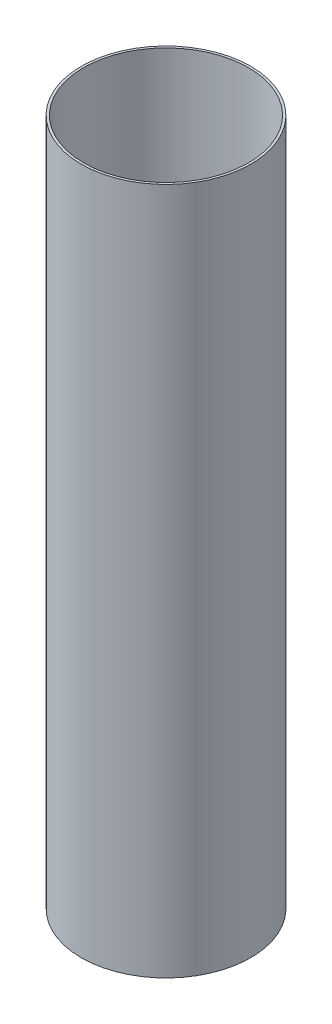
ISO-10303-21;
HEADER;
FILE_DESCRIPTION(('STEP AP214'),'2;1');
FILE_NAME('part.step','',(''),(''),'','','');
FILE_SCHEMA(('AUTOMOTIVE_DESIGN { 1 0 10303 214 1 1 1 1 }'));
ENDSEC;
DATA;
#1=APPLICATION_CONTEXT('core data for automotive mechanical design processes');
#2=APPLICATION_PROTOCOL_DEFINITION('international standard','automotive_design',2000,#1);
#3=PRODUCT_CONTEXT('',#1,'mechanical');
#4=PRODUCT('Part','Part','',(#3));
#5=PRODUCT_RELATED_PRODUCT_CATEGORY('part','',(#4));
#6=PRODUCT_DEFINITION_FORMATION('','',#4);
#7=PRODUCT_DEFINITION_CONTEXT('part definition',#1,'design');
#8=PRODUCT_DEFINITION('design','',#6,#7);
#9=PRODUCT_DEFINITION_SHAPE('','',#8);
#10=(LENGTH_UNIT() NAMED_UNIT(*) SI_UNIT(.MILLI.,.METRE.));
#11=(NAMED_UNIT(*) PLANE_ANGLE_UNIT() SI_UNIT($,.RADIAN.));
#12=(NAMED_UNIT(*) SI_UNIT($,.STERADIAN.) SOLID_ANGLE_UNIT());
#13=UNCERTAINTY_MEASURE_WITH_UNIT(LENGTH_MEASURE(1.E-05),#10,'distance_accuracy_value','');
#14=(GEOMETRIC_REPRESENTATION_CONTEXT(3) GLOBAL_UNCERTAINTY_ASSIGNED_CONTEXT((#13)) GLOBAL_UNIT_ASSIGNED_CONTEXT((#10,
#11,#12)) REPRESENTATION_CONTEXT('',''));
#15=CARTESIAN_POINT('',(0.,0.,0.));
#16=DIRECTION('',(0.,0.,1.));
#17=DIRECTION('',(1.,0.,0.));
#18=AXIS2_PLACEMENT_3D('',#15,#16,#17);
#19=CARTESIAN_POINT('',(0.,63.5,0.));
#20=DIRECTION('',(0.,1.,0.));
#21=DIRECTION('',(0.,0.,1.));
#22=AXIS2_PLACEMENT_3D('',#19,#20,#21);
#23=PLANE('',#22);
#24=CARTESIAN_POINT('',(0.,63.5,0.));
#25=DIRECTION('',(0.,1.,0.));
#26=DIRECTION('',(0.,0.,1.));
#27=AXIS2_PLACEMENT_3D('',#24,#25,#26);
#28=CIRCLE('',#27,7.8359);
#29=CARTESIAN_POINT('',(0.,63.5,7.8359));
#30=VERTEX_POINT('',#29);
#31=EDGE_CURVE('E10',#30,#30,#28,.T.);
#32=ORIENTED_EDGE('',*,*,#31,.T.);
#33=EDGE_LOOP('',(#32));
#34=FACE_BOUND('',#33,.T.);
#35=CARTESIAN_POINT('',(0.,63.5,0.));
#36=DIRECTION('',(0.,1.,0.));
#37=DIRECTION('',(0.,0.,1.));
#38=AXIS2_PLACEMENT_3D('',#35,#36,#37);
#39=CIRCLE('',#38,7.62);
#40=CARTESIAN_POINT('',(0.,63.5,7.62));
#41=VERTEX_POINT('',#40);
#42=EDGE_CURVE('E46',#41,#41,#39,.T.);
#43=ORIENTED_EDGE('',*,*,#42,.F.);
#44=EDGE_LOOP('',(#43));
#45=FACE_BOUND('',#44,.T.);
#46=ADVANCED_FACE('F35',(#34,#45),#23,.T.);
#47=CARTESIAN_POINT('',(0.,0.,0.));
#48=DIRECTION('',(0.,1.,0.));
#49=DIRECTION('',(0.,0.,1.));
#50=AXIS2_PLACEMENT_3D('',#47,#48,#49);
#51=PLANE('',#50);
#52=CARTESIAN_POINT('',(0.,0.,0.));
#53=DIRECTION('',(0.,1.,0.));
#54=DIRECTION('',(0.,0.,1.));
#55=AXIS2_PLACEMENT_3D('',#52,#53,#54);
#56=CIRCLE('',#55,7.8359);
#57=CARTESIAN_POINT('',(0.,0.,7.8359));
#58=VERTEX_POINT('',#57);
#59=EDGE_CURVE('E39',#58,#58,#56,.T.);
#60=ORIENTED_EDGE('',*,*,#59,.F.);
#61=EDGE_LOOP('',(#60));
#62=FACE_BOUND('',#61,.T.);
#63=CARTESIAN_POINT('',(0.,0.,0.));
#64=DIRECTION('',(0.,1.,0.));
#65=DIRECTION('',(0.,0.,1.));
#66=AXIS2_PLACEMENT_3D('',#63,#64,#65);
#67=CIRCLE('',#66,7.62);
#68=CARTESIAN_POINT('',(0.,0.,7.62));
#69=VERTEX_POINT('',#68);
#70=EDGE_CURVE('E48',#69,#69,#67,.T.);
#71=ORIENTED_EDGE('',*,*,#70,.T.);
#72=EDGE_LOOP('',(#71));
#73=FACE_BOUND('',#72,.T.);
#74=ADVANCED_FACE('F58',(#62,#73),#51,.F.);
#75=CARTESIAN_POINT('',(0.,63.5,0.));
#76=DIRECTION('',(0.,-1.,0.));
#77=DIRECTION('',(0.,0.,-1.));
#78=AXIS2_PLACEMENT_3D('',#75,#76,#77);
#79=CYLINDRICAL_SURFACE('',#78,7.8359);
#80=ORIENTED_EDGE('',*,*,#31,.F.);
#81=EDGE_LOOP('',(#80));
#82=FACE_BOUND('',#81,.T.);
#83=ORIENTED_EDGE('',*,*,#59,.T.);
#84=EDGE_LOOP('',(#83));
#85=FACE_BOUND('',#84,.T.);
#86=ADVANCED_FACE('F37',(#82,#85),#79,.T.);
#87=CARTESIAN_POINT('',(0.,63.5,0.));
#88=DIRECTION('',(0.,-1.,0.));
#89=DIRECTION('',(0.,0.,-1.));
#90=AXIS2_PLACEMENT_3D('',#87,#88,#89);
#91=CYLINDRICAL_SURFACE('',#90,7.62);
#92=ORIENTED_EDGE('',*,*,#42,.T.);
#93=EDGE_LOOP('',(#92));
#94=FACE_BOUND('',#93,.T.);
#95=ORIENTED_EDGE('',*,*,#70,.F.);
#96=EDGE_LOOP('',(#95));
#97=FACE_BOUND('',#96,.T.);
#98=ADVANCED_FACE('F54',(#94,#97),#91,.F.);
#99=CLOSED_SHELL('',(#46,#74,#86,#98));
#100=MANIFOLD_SOLID_BREP('B2',#99);
#101=ADVANCED_BREP_SHAPE_REPRESENTATION('',(#18,#100),#14);
#102=SHAPE_DEFINITION_REPRESENTATION(#9,#101);
ENDSEC;
END-ISO-10303-21;
